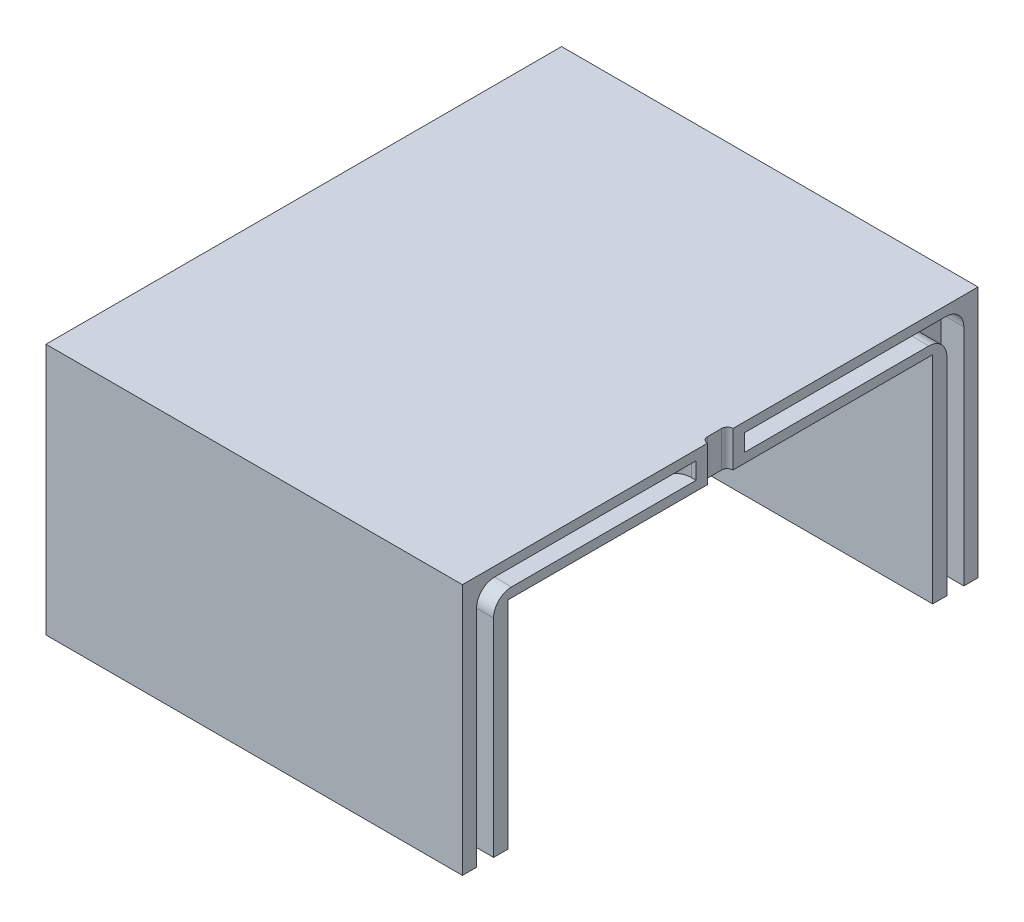
ISO-10303-21;
HEADER;
FILE_DESCRIPTION(('STEP AP214'),'2;1');
FILE_NAME('part.step','',(''),(''),'','','');
FILE_SCHEMA(('AUTOMOTIVE_DESIGN { 1 0 10303 214 1 1 1 1 }'));
ENDSEC;
DATA;
#1=APPLICATION_CONTEXT('core data for automotive mechanical design processes');
#2=APPLICATION_PROTOCOL_DEFINITION('international standard','automotive_design',2000,#1);
#3=PRODUCT_CONTEXT('',#1,'mechanical');
#4=PRODUCT('Part','Part','',(#3));
#5=PRODUCT_RELATED_PRODUCT_CATEGORY('part','',(#4));
#6=PRODUCT_DEFINITION_FORMATION('','',#4);
#7=PRODUCT_DEFINITION_CONTEXT('part definition',#1,'design');
#8=PRODUCT_DEFINITION('design','',#6,#7);
#9=PRODUCT_DEFINITION_SHAPE('','',#8);
#10=(LENGTH_UNIT() NAMED_UNIT(*) SI_UNIT(.MILLI.,.METRE.));
#11=(NAMED_UNIT(*) PLANE_ANGLE_UNIT() SI_UNIT($,.RADIAN.));
#12=(NAMED_UNIT(*) SI_UNIT($,.STERADIAN.) SOLID_ANGLE_UNIT());
#13=UNCERTAINTY_MEASURE_WITH_UNIT(LENGTH_MEASURE(1.E-05),#10,'distance_accuracy_value','');
#14=(GEOMETRIC_REPRESENTATION_CONTEXT(3) GLOBAL_UNCERTAINTY_ASSIGNED_CONTEXT((#13)) GLOBAL_UNIT_ASSIGNED_CONTEXT((#10,
#11,#12)) REPRESENTATION_CONTEXT('',''));
#15=CARTESIAN_POINT('',(0.,0.,0.));
#16=DIRECTION('',(0.,0.,1.));
#17=DIRECTION('',(1.,0.,0.));
#18=AXIS2_PLACEMENT_3D('',#15,#16,#17);
#19=CARTESIAN_POINT('',(0.,19.05,0.));
#20=DIRECTION('',(1.,0.,0.));
#21=DIRECTION('',(0.,0.,-1.));
#22=AXIS2_PLACEMENT_3D('',#19,#20,#21);
#23=PLANE('',#22);
#24=DIRECTION('',(0.,-1.,0.));
#25=VECTOR('',#24,1.);
#26=CARTESIAN_POINT('',(0.,0.,2.75));
#27=LINE('',#26,#25);
#28=CARTESIAN_POINT('',(0.,18.3,2.75));
#29=VERTEX_POINT('',#28);
#30=CARTESIAN_POINT('',(0.,0.,2.75));
#31=VERTEX_POINT('',#30);
#32=EDGE_CURVE('E305',#29,#31,#27,.T.);
#33=ORIENTED_EDGE('',*,*,#32,.F.);
#34=CARTESIAN_POINT('',(0.,18.3,4.3375));
#35=DIRECTION('',(1.,0.,0.));
#36=DIRECTION('',(0.,0.,-1.));
#37=AXIS2_PLACEMENT_3D('',#34,#35,#36);
#38=CIRCLE('',#37,1.5875);
#39=CARTESIAN_POINT('',(0.,19.8875,4.3375));
#40=VERTEX_POINT('',#39);
#41=EDGE_CURVE('E445',#29,#40,#38,.T.);
#42=ORIENTED_EDGE('',*,*,#41,.T.);
#43=DIRECTION('',(0.,0.,-1.));
#44=VECTOR('',#43,1.);
#45=CARTESIAN_POINT('',(0.,19.8875,0.));
#46=LINE('',#45,#44);
#47=CARTESIAN_POINT('',(0.,19.8875,20.625));
#48=VERTEX_POINT('',#47);
#49=EDGE_CURVE('E302',#48,#40,#46,.T.);
#50=ORIENTED_EDGE('',*,*,#49,.F.);
#51=DIRECTION('',(0.,-1.,0.));
#52=VECTOR('',#51,1.);
#53=CARTESIAN_POINT('',(0.,0.,20.625));
#54=LINE('',#53,#52);
#55=CARTESIAN_POINT('',(0.,21.3875,20.625));
#56=VERTEX_POINT('',#55);
#57=EDGE_CURVE('E299',#56,#48,#54,.T.);
#58=ORIENTED_EDGE('',*,*,#57,.F.);
#59=DIRECTION('',(0.,0.,-1.));
#60=VECTOR('',#59,1.);
#61=CARTESIAN_POINT('',(0.,21.3875,0.));
#62=LINE('',#61,#60);
#63=CARTESIAN_POINT('',(0.,21.3875,2.8375));
#64=VERTEX_POINT('',#63);
#65=EDGE_CURVE('E296',#56,#64,#62,.T.);
#66=ORIENTED_EDGE('',*,*,#65,.T.);
#67=CARTESIAN_POINT('',(0.,19.8,2.8375));
#68=DIRECTION('',(1.,0.,0.));
#69=DIRECTION('',(0.,0.,-1.));
#70=AXIS2_PLACEMENT_3D('',#67,#68,#69);
#71=CIRCLE('',#70,1.5875);
#72=CARTESIAN_POINT('',(0.,19.8,1.25));
#73=VERTEX_POINT('',#72);
#74=EDGE_CURVE('E11',#64,#73,#71,.F.);
#75=ORIENTED_EDGE('',*,*,#74,.T.);
#76=DIRECTION('',(0.,-1.,0.));
#77=VECTOR('',#76,1.);
#78=CARTESIAN_POINT('',(0.,0.,1.25));
#79=LINE('',#78,#77);
#80=CARTESIAN_POINT('',(0.,0.,1.25));
#81=VERTEX_POINT('',#80);
#82=EDGE_CURVE('E285',#73,#81,#79,.T.);
#83=ORIENTED_EDGE('',*,*,#82,.T.);
#84=DIRECTION('',(0.,0.,1.));
#85=VECTOR('',#84,1.);
#86=CARTESIAN_POINT('',(0.,0.,0.));
#87=LINE('',#86,#85);
#88=CARTESIAN_POINT('',(0.,0.,0.));
#89=VERTEX_POINT('',#88);
#90=EDGE_CURVE('E393',#89,#81,#87,.T.);
#91=ORIENTED_EDGE('',*,*,#90,.F.);
#92=DIRECTION('',(0.,-1.,0.));
#93=VECTOR('',#92,1.);
#94=CARTESIAN_POINT('',(0.,19.05,0.));
#95=LINE('',#94,#93);
#96=CARTESIAN_POINT('',(0.,22.225,0.));
#97=VERTEX_POINT('',#96);
#98=EDGE_CURVE('E414',#97,#89,#95,.T.);
#99=ORIENTED_EDGE('',*,*,#98,.F.);
#100=DIRECTION('',(0.,0.,-1.));
#101=VECTOR('',#100,1.);
#102=CARTESIAN_POINT('',(0.,22.225,0.));
#103=LINE('',#102,#101);
#104=CARTESIAN_POINT('',(0.,22.225,21.625));
#105=VERTEX_POINT('',#104);
#106=EDGE_CURVE('E330',#105,#97,#103,.T.);
#107=ORIENTED_EDGE('',*,*,#106,.F.);
#108=DIRECTION('',(0.,-1.,0.));
#109=VECTOR('',#108,1.);
#110=CARTESIAN_POINT('',(0.,22.225,21.625));
#111=LINE('',#110,#109);
#112=CARTESIAN_POINT('',(0.,19.05,21.625));
#113=VERTEX_POINT('',#112);
#114=EDGE_CURVE('E353',#105,#113,#111,.T.);
#115=ORIENTED_EDGE('',*,*,#114,.T.);
#116=DIRECTION('',(0.,0.,-1.));
#117=VECTOR('',#116,1.);
#118=CARTESIAN_POINT('',(0.,19.05,0.));
#119=LINE('',#118,#117);
#120=CARTESIAN_POINT('',(0.,19.05,4.));
#121=VERTEX_POINT('',#120);
#122=EDGE_CURVE('E329',#113,#121,#119,.T.);
#123=ORIENTED_EDGE('',*,*,#122,.T.);
#124=DIRECTION('',(0.,-1.,0.));
#125=VECTOR('',#124,1.);
#126=CARTESIAN_POINT('',(0.,19.05,4.));
#127=LINE('',#126,#125);
#128=CARTESIAN_POINT('',(0.,0.,4.));
#129=VERTEX_POINT('',#128);
#130=EDGE_CURVE('E416',#121,#129,#127,.T.);
#131=ORIENTED_EDGE('',*,*,#130,.T.);
#132=EDGE_CURVE('E392',#31,#129,#87,.T.);
#133=ORIENTED_EDGE('',*,*,#132,.F.);
#134=EDGE_LOOP('',(#33,#42,#50,#58,#66,#75,#83,#91,#99,#107,#115,#123,#131,#133));
#135=FACE_BOUND('',#134,.T.);
#136=ADVANCED_FACE('F41',(#135),#23,.T.);
#137=CARTESIAN_POINT('',(0.,0.,0.));
#138=DIRECTION('',(0.,1.,0.));
#139=DIRECTION('',(0.,0.,1.));
#140=AXIS2_PLACEMENT_3D('',#137,#138,#139);
#141=PLANE('',#140);
#142=CARTESIAN_POINT('',(-18.375,0.,43.));
#143=DIRECTION('',(0.,-1.,0.));
#144=DIRECTION('',(0.,0.,-1.));
#145=AXIS2_PLACEMENT_3D('',#142,#143,#144);
#146=CIRCLE('',#145,0.88899999999999);
#147=CARTESIAN_POINT('',(-18.375,0.,42.111));
#148=VERTEX_POINT('',#147);
#149=EDGE_CURVE('E323',#148,#148,#146,.T.);
#150=ORIENTED_EDGE('',*,*,#149,.F.);
#151=EDGE_LOOP('',(#150));
#152=FACE_BOUND('',#151,.T.);
#153=CARTESIAN_POINT('',(-18.375,0.,2.5));
#154=DIRECTION('',(0.,-1.,0.));
#155=DIRECTION('',(0.,0.,-1.));
#156=AXIS2_PLACEMENT_3D('',#153,#154,#155);
#157=CIRCLE('',#156,0.88899999999999);
#158=CARTESIAN_POINT('',(-18.375,0.,1.61100000000001));
#159=VERTEX_POINT('',#158);
#160=EDGE_CURVE('E275',#159,#159,#157,.T.);
#161=ORIENTED_EDGE('',*,*,#160,.F.);
#162=EDGE_LOOP('',(#161));
#163=FACE_BOUND('',#162,.T.);
#164=CARTESIAN_POINT('',(0.,0.,41.5));
#165=VERTEX_POINT('',#164);
#166=CARTESIAN_POINT('',(0.,0.,42.75));
#167=VERTEX_POINT('',#166);
#168=EDGE_CURVE('E271',#165,#167,#87,.T.);
#169=ORIENTED_EDGE('',*,*,#168,.T.);
#170=DIRECTION('',(1.,0.,0.));
#171=VECTOR('',#170,1.);
#172=CARTESIAN_POINT('',(-2.,0.,42.75));
#173=LINE('',#172,#171);
#174=CARTESIAN_POINT('',(-2.,0.,42.75));
#175=VERTEX_POINT('',#174);
#176=EDGE_CURVE('E249',#175,#167,#173,.T.);
#177=ORIENTED_EDGE('',*,*,#176,.F.);
#178=DIRECTION('',(0.,0.,-1.));
#179=VECTOR('',#178,1.);
#180=CARTESIAN_POINT('',(-2.,0.,0.));
#181=LINE('',#180,#179);
#182=CARTESIAN_POINT('',(-2.,0.,44.25));
#183=VERTEX_POINT('',#182);
#184=EDGE_CURVE('E256',#183,#175,#181,.T.);
#185=ORIENTED_EDGE('',*,*,#184,.F.);
#186=DIRECTION('',(1.,0.,0.));
#187=VECTOR('',#186,1.);
#188=CARTESIAN_POINT('',(-2.,0.,44.25));
#189=LINE('',#188,#187);
#190=CARTESIAN_POINT('',(0.,0.,44.25));
#191=VERTEX_POINT('',#190);
#192=EDGE_CURVE('E273',#183,#191,#189,.T.);
#193=ORIENTED_EDGE('',*,*,#192,.T.);
#194=CARTESIAN_POINT('',(0.,0.,45.5));
#195=VERTEX_POINT('',#194);
#196=EDGE_CURVE('E404',#191,#195,#87,.T.);
#197=ORIENTED_EDGE('',*,*,#196,.T.);
#198=DIRECTION('',(-1.,0.,0.));
#199=VECTOR('',#198,1.);
#200=CARTESIAN_POINT('',(0.,0.,45.5));
#201=LINE('',#200,#199);
#202=CARTESIAN_POINT('',(-36.75,0.,45.5));
#203=VERTEX_POINT('',#202);
#204=EDGE_CURVE('E401',#195,#203,#201,.T.);
#205=ORIENTED_EDGE('',*,*,#204,.T.);
#206=DIRECTION('',(0.,0.,1.));
#207=VECTOR('',#206,1.);
#208=CARTESIAN_POINT('',(-36.75,0.,0.));
#209=LINE('',#208,#207);
#210=CARTESIAN_POINT('',(-36.75,0.,0.));
#211=VERTEX_POINT('',#210);
#212=EDGE_CURVE('E398',#211,#203,#209,.T.);
#213=ORIENTED_EDGE('',*,*,#212,.F.);
#214=DIRECTION('',(-1.,0.,0.));
#215=VECTOR('',#214,1.);
#216=CARTESIAN_POINT('',(0.,0.,0.));
#217=LINE('',#216,#215);
#218=EDGE_CURVE('E396',#89,#211,#217,.T.);
#219=ORIENTED_EDGE('',*,*,#218,.F.);
#220=ORIENTED_EDGE('',*,*,#90,.T.);
#221=DIRECTION('',(1.,0.,0.));
#222=VECTOR('',#221,1.);
#223=CARTESIAN_POINT('',(-2.,0.,1.25));
#224=LINE('',#223,#222);
#225=CARTESIAN_POINT('',(-2.,0.,1.25));
#226=VERTEX_POINT('',#225);
#227=EDGE_CURVE('E308',#226,#81,#224,.T.);
#228=ORIENTED_EDGE('',*,*,#227,.F.);
#229=DIRECTION('',(0.,0.,-1.));
#230=VECTOR('',#229,1.);
#231=CARTESIAN_POINT('',(-2.,0.,0.));
#232=LINE('',#231,#230);
#233=CARTESIAN_POINT('',(-2.,0.,2.75));
#234=VERTEX_POINT('',#233);
#235=EDGE_CURVE('E290',#234,#226,#232,.T.);
#236=ORIENTED_EDGE('',*,*,#235,.F.);
#237=DIRECTION('',(1.,0.,0.));
#238=VECTOR('',#237,1.);
#239=CARTESIAN_POINT('',(-2.,0.,2.75));
#240=LINE('',#239,#238);
#241=EDGE_CURVE('E312',#234,#31,#240,.T.);
#242=ORIENTED_EDGE('',*,*,#241,.T.);
#243=ORIENTED_EDGE('',*,*,#132,.T.);
#244=DIRECTION('',(-1.,0.,0.));
#245=VECTOR('',#244,1.);
#246=CARTESIAN_POINT('',(0.,0.,4.));
#247=LINE('',#246,#245);
#248=CARTESIAN_POINT('',(-32.75,0.,4.));
#249=VERTEX_POINT('',#248);
#250=EDGE_CURVE('E389',#129,#249,#247,.T.);
#251=ORIENTED_EDGE('',*,*,#250,.T.);
#252=DIRECTION('',(0.,0.,1.));
#253=VECTOR('',#252,1.);
#254=CARTESIAN_POINT('',(-32.75,0.,0.));
#255=LINE('',#254,#253);
#256=CARTESIAN_POINT('',(-32.75,0.,41.5));
#257=VERTEX_POINT('',#256);
#258=EDGE_CURVE('E386',#249,#257,#255,.T.);
#259=ORIENTED_EDGE('',*,*,#258,.T.);
#260=DIRECTION('',(1.,0.,0.));
#261=VECTOR('',#260,1.);
#262=CARTESIAN_POINT('',(0.,0.,41.5));
#263=LINE('',#262,#261);
#264=EDGE_CURVE('E374',#257,#165,#263,.T.);
#265=ORIENTED_EDGE('',*,*,#264,.T.);
#266=EDGE_LOOP('',(#169,#177,#185,#193,#197,#205,#213,#219,#220,#228,#236,#242,#243,#251,#259,#265));
#267=FACE_BOUND('',#266,.T.);
#268=ADVANCED_FACE('F268',(#152,#163,#267),#141,.F.);
#269=CARTESIAN_POINT('',(0.,19.05,41.5));
#270=DIRECTION('',(0.,0.,-1.));
#271=DIRECTION('',(-1.,0.,0.));
#272=AXIS2_PLACEMENT_3D('',#269,#270,#271);
#273=PLANE('',#272);
#274=ORIENTED_EDGE('',*,*,#264,.F.);
#275=DIRECTION('',(0.,-1.,0.));
#276=VECTOR('',#275,1.);
#277=CARTESIAN_POINT('',(-32.75,19.05,41.5));
#278=LINE('',#277,#276);
#279=CARTESIAN_POINT('',(-32.75,19.05,41.5));
#280=VERTEX_POINT('',#279);
#281=EDGE_CURVE('E421',#280,#257,#278,.T.);
#282=ORIENTED_EDGE('',*,*,#281,.F.);
#283=DIRECTION('',(1.,0.,0.));
#284=VECTOR('',#283,1.);
#285=CARTESIAN_POINT('',(0.,19.05,41.5));
#286=LINE('',#285,#284);
#287=CARTESIAN_POINT('',(0.,19.05,41.5));
#288=VERTEX_POINT('',#287);
#289=EDGE_CURVE('E375',#280,#288,#286,.T.);
#290=ORIENTED_EDGE('',*,*,#289,.T.);
#291=DIRECTION('',(0.,-1.,0.));
#292=VECTOR('',#291,1.);
#293=CARTESIAN_POINT('',(0.,19.05,41.5));
#294=LINE('',#293,#292);
#295=EDGE_CURVE('E384',#288,#165,#294,.T.);
#296=ORIENTED_EDGE('',*,*,#295,.T.);
#297=EDGE_LOOP('',(#274,#282,#290,#296));
#298=FACE_BOUND('',#297,.T.);
#299=ADVANCED_FACE('F516',(#298),#273,.T.);
#300=CARTESIAN_POINT('',(-32.75,19.05,0.));
#301=DIRECTION('',(1.,0.,0.));
#302=DIRECTION('',(0.,0.,-1.));
#303=AXIS2_PLACEMENT_3D('',#300,#301,#302);
#304=PLANE('',#303);
#305=ORIENTED_EDGE('',*,*,#258,.F.);
#306=DIRECTION('',(0.,-1.,0.));
#307=VECTOR('',#306,1.);
#308=CARTESIAN_POINT('',(-32.75,19.05,4.));
#309=LINE('',#308,#307);
#310=CARTESIAN_POINT('',(-32.75,19.05,4.));
#311=VERTEX_POINT('',#310);
#312=EDGE_CURVE('E419',#311,#249,#309,.T.);
#313=ORIENTED_EDGE('',*,*,#312,.F.);
#314=DIRECTION('',(0.,0.,1.));
#315=VECTOR('',#314,1.);
#316=CARTESIAN_POINT('',(-32.75,19.05,0.));
#317=LINE('',#316,#315);
#318=EDGE_CURVE('E378',#311,#280,#317,.T.);
#319=ORIENTED_EDGE('',*,*,#318,.T.);
#320=ORIENTED_EDGE('',*,*,#281,.T.);
#321=EDGE_LOOP('',(#305,#313,#319,#320));
#322=FACE_BOUND('',#321,.T.);
#323=ADVANCED_FACE('F585',(#322),#304,.T.);
#324=CARTESIAN_POINT('',(0.,19.05,4.));
#325=DIRECTION('',(0.,0.,1.));
#326=DIRECTION('',(1.,0.,0.));
#327=AXIS2_PLACEMENT_3D('',#324,#325,#326);
#328=PLANE('',#327);
#329=ORIENTED_EDGE('',*,*,#250,.F.);
#330=ORIENTED_EDGE('',*,*,#130,.F.);
#331=DIRECTION('',(-1.,0.,0.));
#332=VECTOR('',#331,1.);
#333=CARTESIAN_POINT('',(0.,19.05,4.));
#334=LINE('',#333,#332);
#335=EDGE_CURVE('E381',#121,#311,#334,.T.);
#336=ORIENTED_EDGE('',*,*,#335,.T.);
#337=ORIENTED_EDGE('',*,*,#312,.T.);
#338=EDGE_LOOP('',(#329,#330,#336,#337));
#339=FACE_BOUND('',#338,.T.);
#340=ADVANCED_FACE('F589',(#339),#328,.T.);
#341=CARTESIAN_POINT('',(0.,19.05,0.));
#342=DIRECTION('',(0.,0.,1.));
#343=DIRECTION('',(1.,0.,0.));
#344=AXIS2_PLACEMENT_3D('',#341,#342,#343);
#345=PLANE('',#344);
#346=ORIENTED_EDGE('',*,*,#218,.T.);
#347=DIRECTION('',(0.,-1.,0.));
#348=VECTOR('',#347,1.);
#349=CARTESIAN_POINT('',(-36.75,19.05,0.));
#350=LINE('',#349,#348);
#351=CARTESIAN_POINT('',(-36.75,22.225,0.));
#352=VERTEX_POINT('',#351);
#353=EDGE_CURVE('E411',#352,#211,#350,.T.);
#354=ORIENTED_EDGE('',*,*,#353,.F.);
#355=DIRECTION('',(1.,0.,0.));
#356=VECTOR('',#355,1.);
#357=CARTESIAN_POINT('',(0.,22.225,0.));
#358=LINE('',#357,#356);
#359=EDGE_CURVE('E333',#352,#97,#358,.T.);
#360=ORIENTED_EDGE('',*,*,#359,.T.);
#361=ORIENTED_EDGE('',*,*,#98,.T.);
#362=EDGE_LOOP('',(#346,#354,#360,#361));
#363=FACE_BOUND('',#362,.T.);
#364=ADVANCED_FACE('F593',(#363),#345,.F.);
#365=CARTESIAN_POINT('',(-36.75,19.05,0.));
#366=DIRECTION('',(1.,0.,0.));
#367=DIRECTION('',(0.,0.,-1.));
#368=AXIS2_PLACEMENT_3D('',#365,#366,#367);
#369=PLANE('',#368);
#370=ORIENTED_EDGE('',*,*,#212,.T.);
#371=DIRECTION('',(0.,-1.,0.));
#372=VECTOR('',#371,1.);
#373=CARTESIAN_POINT('',(-36.75,19.05,45.5));
#374=LINE('',#373,#372);
#375=CARTESIAN_POINT('',(-36.75,22.225,45.5));
#376=VERTEX_POINT('',#375);
#377=EDGE_CURVE('E409',#376,#203,#374,.T.);
#378=ORIENTED_EDGE('',*,*,#377,.F.);
#379=DIRECTION('',(0.,0.,-1.));
#380=VECTOR('',#379,1.);
#381=CARTESIAN_POINT('',(-36.75,22.225,0.));
#382=LINE('',#381,#380);
#383=EDGE_CURVE('E337',#376,#352,#382,.T.);
#384=ORIENTED_EDGE('',*,*,#383,.T.);
#385=ORIENTED_EDGE('',*,*,#353,.T.);
#386=EDGE_LOOP('',(#370,#378,#384,#385));
#387=FACE_BOUND('',#386,.T.);
#388=ADVANCED_FACE('F531',(#387),#369,.F.);
#389=CARTESIAN_POINT('',(0.,19.05,45.5));
#390=DIRECTION('',(0.,0.,1.));
#391=DIRECTION('',(1.,0.,0.));
#392=AXIS2_PLACEMENT_3D('',#389,#390,#391);
#393=PLANE('',#392);
#394=ORIENTED_EDGE('',*,*,#204,.F.);
#395=DIRECTION('',(0.,-1.,0.));
#396=VECTOR('',#395,1.);
#397=CARTESIAN_POINT('',(0.,19.05,45.5));
#398=LINE('',#397,#396);
#399=CARTESIAN_POINT('',(0.,22.225,45.5));
#400=VERTEX_POINT('',#399);
#401=EDGE_CURVE('E406',#400,#195,#398,.T.);
#402=ORIENTED_EDGE('',*,*,#401,.F.);
#403=DIRECTION('',(1.,0.,0.));
#404=VECTOR('',#403,1.);
#405=CARTESIAN_POINT('',(0.,22.225,45.5));
#406=LINE('',#405,#404);
#407=EDGE_CURVE('E340',#376,#400,#406,.T.);
#408=ORIENTED_EDGE('',*,*,#407,.F.);
#409=ORIENTED_EDGE('',*,*,#377,.T.);
#410=EDGE_LOOP('',(#394,#402,#408,#409));
#411=FACE_BOUND('',#410,.T.);
#412=ADVANCED_FACE('F522',(#411),#393,.T.);
#413=DIRECTION('',(0.,0.,-1.));
#414=VECTOR('',#413,1.);
#415=CARTESIAN_POINT('',(0.,19.8875,0.));
#416=LINE('',#415,#414);
#417=CARTESIAN_POINT('',(0.,19.8875,41.1625));
#418=VERTEX_POINT('',#417);
#419=CARTESIAN_POINT('',(0.,19.8875,24.875));
#420=VERTEX_POINT('',#419);
#421=EDGE_CURVE('E536',#418,#420,#416,.T.);
#422=ORIENTED_EDGE('',*,*,#421,.F.);
#423=CARTESIAN_POINT('',(0.,18.3,41.1625));
#424=DIRECTION('',(1.,0.,0.));
#425=DIRECTION('',(0.,0.,-1.));
#426=AXIS2_PLACEMENT_3D('',#423,#424,#425);
#427=CIRCLE('',#426,1.5875);
#428=CARTESIAN_POINT('',(0.,18.3,42.75));
#429=VERTEX_POINT('',#428);
#430=EDGE_CURVE('E439',#418,#429,#427,.T.);
#431=ORIENTED_EDGE('',*,*,#430,.T.);
#432=DIRECTION('',(0.,1.,0.));
#433=VECTOR('',#432,1.);
#434=CARTESIAN_POINT('',(0.,0.,42.75));
#435=LINE('',#434,#433);
#436=EDGE_CURVE('E542',#167,#429,#435,.T.);
#437=ORIENTED_EDGE('',*,*,#436,.F.);
#438=ORIENTED_EDGE('',*,*,#168,.F.);
#439=ORIENTED_EDGE('',*,*,#295,.F.);
#440=DIRECTION('',(0.,0.,-1.));
#441=VECTOR('',#440,1.);
#442=CARTESIAN_POINT('',(0.,19.05,0.));
#443=LINE('',#442,#441);
#444=CARTESIAN_POINT('',(0.,19.05,23.875));
#445=VERTEX_POINT('',#444);
#446=EDGE_CURVE('E356',#288,#445,#443,.T.);
#447=ORIENTED_EDGE('',*,*,#446,.T.);
#448=DIRECTION('',(0.,-1.,0.));
#449=VECTOR('',#448,1.);
#450=CARTESIAN_POINT('',(0.,22.225,23.875));
#451=LINE('',#450,#449);
#452=CARTESIAN_POINT('',(0.,22.225,23.875));
#453=VERTEX_POINT('',#452);
#454=EDGE_CURVE('E371',#453,#445,#451,.T.);
#455=ORIENTED_EDGE('',*,*,#454,.F.);
#456=DIRECTION('',(0.,0.,-1.));
#457=VECTOR('',#456,1.);
#458=CARTESIAN_POINT('',(0.,22.225,0.));
#459=LINE('',#458,#457);
#460=EDGE_CURVE('E343',#400,#453,#459,.T.);
#461=ORIENTED_EDGE('',*,*,#460,.F.);
#462=ORIENTED_EDGE('',*,*,#401,.T.);
#463=ORIENTED_EDGE('',*,*,#196,.F.);
#464=DIRECTION('',(0.,1.,0.));
#465=VECTOR('',#464,1.);
#466=CARTESIAN_POINT('',(0.,0.,44.25));
#467=LINE('',#466,#465);
#468=CARTESIAN_POINT('',(0.,19.8,44.25));
#469=VERTEX_POINT('',#468);
#470=EDGE_CURVE('E545',#191,#469,#467,.T.);
#471=ORIENTED_EDGE('',*,*,#470,.T.);
#472=CARTESIAN_POINT('',(0.,19.8,42.6625));
#473=DIRECTION('',(1.,0.,0.));
#474=DIRECTION('',(0.,0.,-1.));
#475=AXIS2_PLACEMENT_3D('',#472,#473,#474);
#476=CIRCLE('',#475,1.5875);
#477=CARTESIAN_POINT('',(0.,21.3875,42.6625));
#478=VERTEX_POINT('',#477);
#479=EDGE_CURVE('E466',#469,#478,#476,.F.);
#480=ORIENTED_EDGE('',*,*,#479,.T.);
#481=DIRECTION('',(0.,0.,-1.));
#482=VECTOR('',#481,1.);
#483=CARTESIAN_POINT('',(0.,21.3875,0.));
#484=LINE('',#483,#482);
#485=CARTESIAN_POINT('',(0.,21.3875,24.875));
#486=VERTEX_POINT('',#485);
#487=EDGE_CURVE('E550',#478,#486,#484,.T.);
#488=ORIENTED_EDGE('',*,*,#487,.T.);
#489=DIRECTION('',(0.,-1.,0.));
#490=VECTOR('',#489,1.);
#491=CARTESIAN_POINT('',(0.,0.,24.875));
#492=LINE('',#491,#490);
#493=EDGE_CURVE('E311',#486,#420,#492,.T.);
#494=ORIENTED_EDGE('',*,*,#493,.T.);
#495=EDGE_LOOP('',(#422,#431,#437,#438,#439,#447,#455,#461,#462,#463,#471,#480,#488,#494));
#496=FACE_BOUND('',#495,.T.);
#497=ADVANCED_FACE('F512',(#496),#23,.T.);
#498=CARTESIAN_POINT('',(0.,22.225,23.375));
#499=DIRECTION('',(0.,-1.,0.));
#500=DIRECTION('',(0.,0.,-1.));
#501=AXIS2_PLACEMENT_3D('',#498,#499,#500);
#502=CYLINDRICAL_SURFACE('',#501,0.499999999999994);
#503=CARTESIAN_POINT('',(0.,19.05,23.375));
#504=DIRECTION('',(0.,1.,0.));
#505=DIRECTION('',(0.,0.,1.));
#506=AXIS2_PLACEMENT_3D('',#503,#504,#505);
#507=CIRCLE('',#506,0.499999999999994);
#508=CARTESIAN_POINT('',(-0.499999999999991,19.05,23.375));
#509=VERTEX_POINT('',#508);
#510=EDGE_CURVE('E358',#509,#445,#507,.T.);
#511=ORIENTED_EDGE('',*,*,#510,.F.);
#512=DIRECTION('',(0.,-1.,0.));
#513=VECTOR('',#512,1.);
#514=CARTESIAN_POINT('',(-0.499999999999991,22.225,23.375));
#515=LINE('',#514,#513);
#516=CARTESIAN_POINT('',(-0.499999999999991,22.225,23.375));
#517=VERTEX_POINT('',#516);
#518=EDGE_CURVE('E369',#517,#509,#515,.T.);
#519=ORIENTED_EDGE('',*,*,#518,.F.);
#520=CARTESIAN_POINT('',(0.,22.225,23.375));
#521=DIRECTION('',(0.,1.,0.));
#522=DIRECTION('',(0.,0.,1.));
#523=AXIS2_PLACEMENT_3D('',#520,#521,#522);
#524=CIRCLE('',#523,0.499999999999994);
#525=EDGE_CURVE('E345',#517,#453,#524,.T.);
#526=ORIENTED_EDGE('',*,*,#525,.T.);
#527=ORIENTED_EDGE('',*,*,#454,.T.);
#528=EDGE_LOOP('',(#511,#519,#526,#527));
#529=FACE_BOUND('',#528,.T.);
#530=ADVANCED_FACE('F521',(#529),#502,.F.);
#531=CARTESIAN_POINT('',(-0.499999999999993,22.225,0.));
#532=DIRECTION('',(-1.,0.,0.));
#533=DIRECTION('',(0.,0.,1.));
#534=AXIS2_PLACEMENT_3D('',#531,#532,#533);
#535=PLANE('',#534);
#536=DIRECTION('',(0.,0.,-1.));
#537=VECTOR('',#536,1.);
#538=CARTESIAN_POINT('',(-0.499999999999993,19.05,0.));
#539=LINE('',#538,#537);
#540=CARTESIAN_POINT('',(-0.499999999999997,19.05,22.125));
#541=VERTEX_POINT('',#540);
#542=EDGE_CURVE('E361',#509,#541,#539,.T.);
#543=ORIENTED_EDGE('',*,*,#542,.T.);
#544=DIRECTION('',(0.,-1.,0.));
#545=VECTOR('',#544,1.);
#546=CARTESIAN_POINT('',(-0.499999999999997,22.225,22.125));
#547=LINE('',#546,#545);
#548=CARTESIAN_POINT('',(-0.499999999999997,22.225,22.125));
#549=VERTEX_POINT('',#548);
#550=EDGE_CURVE('E367',#549,#541,#547,.T.);
#551=ORIENTED_EDGE('',*,*,#550,.F.);
#552=DIRECTION('',(0.,0.,-1.));
#553=VECTOR('',#552,1.);
#554=CARTESIAN_POINT('',(-0.499999999999993,22.225,0.));
#555=LINE('',#554,#553);
#556=EDGE_CURVE('E348',#517,#549,#555,.T.);
#557=ORIENTED_EDGE('',*,*,#556,.F.);
#558=ORIENTED_EDGE('',*,*,#518,.T.);
#559=EDGE_LOOP('',(#543,#551,#557,#558));
#560=FACE_BOUND('',#559,.T.);
#561=ADVANCED_FACE('F528',(#560),#535,.F.);
#562=CARTESIAN_POINT('',(0.,22.225,22.125));
#563=DIRECTION('',(0.,-1.,0.));
#564=DIRECTION('',(0.,0.,-1.));
#565=AXIS2_PLACEMENT_3D('',#562,#563,#564);
#566=CYLINDRICAL_SURFACE('',#565,0.499999999999994);
#567=CARTESIAN_POINT('',(0.,19.05,22.125));
#568=DIRECTION('',(0.,1.,0.));
#569=DIRECTION('',(0.,0.,1.));
#570=AXIS2_PLACEMENT_3D('',#567,#568,#569);
#571=CIRCLE('',#570,0.499999999999994);
#572=EDGE_CURVE('E334',#113,#541,#571,.T.);
#573=ORIENTED_EDGE('',*,*,#572,.F.);
#574=ORIENTED_EDGE('',*,*,#114,.F.);
#575=CARTESIAN_POINT('',(0.,22.225,22.125));
#576=DIRECTION('',(0.,1.,0.));
#577=DIRECTION('',(0.,0.,1.));
#578=AXIS2_PLACEMENT_3D('',#575,#576,#577);
#579=CIRCLE('',#578,0.499999999999994);
#580=EDGE_CURVE('E350',#105,#549,#579,.T.);
#581=ORIENTED_EDGE('',*,*,#580,.T.);
#582=ORIENTED_EDGE('',*,*,#550,.T.);
#583=EDGE_LOOP('',(#573,#574,#581,#582));
#584=FACE_BOUND('',#583,.T.);
#585=ADVANCED_FACE('F635',(#584),#566,.F.);
#586=CARTESIAN_POINT('',(0.,22.225,23.375));
#587=DIRECTION('',(0.,1.,0.));
#588=DIRECTION('',(0.,0.,1.));
#589=AXIS2_PLACEMENT_3D('',#586,#587,#588);
#590=PLANE('',#589);
#591=ORIENTED_EDGE('',*,*,#106,.T.);
#592=ORIENTED_EDGE('',*,*,#359,.F.);
#593=ORIENTED_EDGE('',*,*,#383,.F.);
#594=ORIENTED_EDGE('',*,*,#407,.T.);
#595=ORIENTED_EDGE('',*,*,#460,.T.);
#596=ORIENTED_EDGE('',*,*,#525,.F.);
#597=ORIENTED_EDGE('',*,*,#556,.T.);
#598=ORIENTED_EDGE('',*,*,#580,.F.);
#599=EDGE_LOOP('',(#591,#592,#593,#594,#595,#596,#597,#598));
#600=FACE_BOUND('',#599,.T.);
#601=ADVANCED_FACE('F610',(#600),#590,.T.);
#602=CARTESIAN_POINT('',(0.,19.05,23.375));
#603=DIRECTION('',(0.,1.,0.));
#604=DIRECTION('',(0.,0.,1.));
#605=AXIS2_PLACEMENT_3D('',#602,#603,#604);
#606=PLANE('',#605);
#607=ORIENTED_EDGE('',*,*,#289,.F.);
#608=ORIENTED_EDGE('',*,*,#318,.F.);
#609=ORIENTED_EDGE('',*,*,#335,.F.);
#610=ORIENTED_EDGE('',*,*,#122,.F.);
#611=ORIENTED_EDGE('',*,*,#572,.T.);
#612=ORIENTED_EDGE('',*,*,#542,.F.);
#613=ORIENTED_EDGE('',*,*,#510,.T.);
#614=ORIENTED_EDGE('',*,*,#446,.F.);
#615=EDGE_LOOP('',(#607,#608,#609,#610,#611,#612,#613,#614));
#616=FACE_BOUND('',#615,.T.);
#617=ADVANCED_FACE('F629',(#616),#606,.F.);
#618=CARTESIAN_POINT('',(-18.375,5.73,43.));
#619=DIRECTION('',(0.,-1.,0.));
#620=DIRECTION('',(0.,0.,-1.));
#621=AXIS2_PLACEMENT_3D('',#618,#619,#620);
#622=CONICAL_SURFACE('',#621,0.888999999999997,1.02974425867665);
#623=CARTESIAN_POINT('',(-18.375,6.2641650903155,43.));
#624=VERTEX_POINT('',#623);
#625=VERTEX_LOOP('',#624);
#626=FACE_BOUND('',#625,.T.);
#627=CARTESIAN_POINT('',(-18.375,5.73,43.));
#628=DIRECTION('',(0.,-1.,0.));
#629=DIRECTION('',(0.,0.,-1.));
#630=AXIS2_PLACEMENT_3D('',#627,#628,#629);
#631=CIRCLE('',#630,0.888999999999997);
#632=CARTESIAN_POINT('',(-18.375,5.73,42.111));
#633=VERTEX_POINT('',#632);
#634=EDGE_CURVE('E326',#633,#633,#631,.T.);
#635=ORIENTED_EDGE('',*,*,#634,.T.);
#636=EDGE_LOOP('',(#635));
#637=FACE_BOUND('',#636,.T.);
#638=ADVANCED_FACE('F646',(#626,#637),#622,.F.);
#639=CARTESIAN_POINT('',(-18.375,0.,43.));
#640=DIRECTION('',(0.,-1.,0.));
#641=DIRECTION('',(0.,0.,-1.));
#642=AXIS2_PLACEMENT_3D('',#639,#640,#641);
#643=CYLINDRICAL_SURFACE('',#642,0.888999999999994);
#644=ORIENTED_EDGE('',*,*,#634,.F.);
#645=EDGE_LOOP('',(#644));
#646=FACE_BOUND('',#645,.T.);
#647=ORIENTED_EDGE('',*,*,#149,.T.);
#648=EDGE_LOOP('',(#647));
#649=FACE_BOUND('',#648,.T.);
#650=ADVANCED_FACE('F650',(#646,#649),#643,.F.);
#651=CARTESIAN_POINT('',(-18.375,5.73,2.5));
#652=DIRECTION('',(0.,-1.,0.));
#653=DIRECTION('',(0.,0.,-1.));
#654=AXIS2_PLACEMENT_3D('',#651,#652,#653);
#655=CONICAL_SURFACE('',#654,0.888999999999997,1.02974425867665);
#656=CARTESIAN_POINT('',(-18.375,6.2641650903155,2.5));
#657=VERTEX_POINT('',#656);
#658=VERTEX_LOOP('',#657);
#659=FACE_BOUND('',#658,.T.);
#660=CARTESIAN_POINT('',(-18.375,5.73,2.5));
#661=DIRECTION('',(0.,-1.,0.));
#662=DIRECTION('',(0.,0.,-1.));
#663=AXIS2_PLACEMENT_3D('',#660,#661,#662);
#664=CIRCLE('',#663,0.888999999999997);
#665=CARTESIAN_POINT('',(-18.375,5.73,1.61100000000001));
#666=VERTEX_POINT('',#665);
#667=EDGE_CURVE('E320',#666,#666,#664,.T.);
#668=ORIENTED_EDGE('',*,*,#667,.T.);
#669=EDGE_LOOP('',(#668));
#670=FACE_BOUND('',#669,.T.);
#671=ADVANCED_FACE('F654',(#659,#670),#655,.F.);
#672=CARTESIAN_POINT('',(-18.375,0.,2.5));
#673=DIRECTION('',(0.,-1.,0.));
#674=DIRECTION('',(0.,0.,-1.));
#675=AXIS2_PLACEMENT_3D('',#672,#673,#674);
#676=CYLINDRICAL_SURFACE('',#675,0.888999999999994);
#677=ORIENTED_EDGE('',*,*,#667,.F.);
#678=EDGE_LOOP('',(#677));
#679=FACE_BOUND('',#678,.T.);
#680=ORIENTED_EDGE('',*,*,#160,.T.);
#681=EDGE_LOOP('',(#680));
#682=FACE_BOUND('',#681,.T.);
#683=ADVANCED_FACE('F658',(#679,#682),#676,.F.);
#684=CARTESIAN_POINT('',(-2.,21.3875,0.));
#685=DIRECTION('',(0.,-1.,0.));
#686=DIRECTION('',(0.,0.,-1.));
#687=AXIS2_PLACEMENT_3D('',#684,#685,#686);
#688=PLANE('',#687);
#689=DIRECTION('',(0.,0.,-1.));
#690=VECTOR('',#689,1.);
#691=CARTESIAN_POINT('',(-2.,21.3875,0.));
#692=LINE('',#691,#690);
#693=CARTESIAN_POINT('',(-2.,21.3875,19.0375));
#694=VERTEX_POINT('',#693);
#695=CARTESIAN_POINT('',(-2.,21.3875,2.8375));
#696=VERTEX_POINT('',#695);
#697=EDGE_CURVE('E282',#694,#696,#692,.T.);
#698=ORIENTED_EDGE('',*,*,#697,.T.);
#699=DIRECTION('',(1.,0.,0.));
#700=VECTOR('',#699,1.);
#701=CARTESIAN_POINT('',(0.,21.3875,2.8375));
#702=LINE('',#701,#700);
#703=EDGE_CURVE('E453',#696,#64,#702,.T.);
#704=ORIENTED_EDGE('',*,*,#703,.T.);
#705=ORIENTED_EDGE('',*,*,#65,.F.);
#706=DIRECTION('',(1.,0.,0.));
#707=VECTOR('',#706,1.);
#708=CARTESIAN_POINT('',(-2.,21.3875,20.625));
#709=LINE('',#708,#707);
#710=CARTESIAN_POINT('',(-0.4125,21.3875,20.625));
#711=VERTEX_POINT('',#710);
#712=EDGE_CURVE('E295',#711,#56,#709,.T.);
#713=ORIENTED_EDGE('',*,*,#712,.F.);
#714=CARTESIAN_POINT('',(-0.4125,21.3875,19.0375));
#715=DIRECTION('',(0.,-1.,0.));
#716=DIRECTION('',(0.,0.,-1.));
#717=AXIS2_PLACEMENT_3D('',#714,#715,#716);
#718=CIRCLE('',#717,1.5875);
#719=EDGE_CURVE('E451',#711,#694,#718,.T.);
#720=ORIENTED_EDGE('',*,*,#719,.T.);
#721=EDGE_LOOP('',(#698,#704,#705,#713,#720));
#722=FACE_BOUND('',#721,.T.);
#723=ADVANCED_FACE('F495',(#722),#688,.T.);
#724=CARTESIAN_POINT('',(-2.,0.,1.25));
#725=DIRECTION('',(0.,0.,1.));
#726=DIRECTION('',(0.,-1.,0.));
#727=AXIS2_PLACEMENT_3D('',#724,#725,#726);
#728=PLANE('',#727);
#729=ORIENTED_EDGE('',*,*,#82,.F.);
#730=DIRECTION('',(1.,0.,0.));
#731=VECTOR('',#730,1.);
#732=CARTESIAN_POINT('',(-2.,19.8,1.25));
#733=LINE('',#732,#731);
#734=CARTESIAN_POINT('',(-2.,19.8,1.25));
#735=VERTEX_POINT('',#734);
#736=EDGE_CURVE('E56',#73,#735,#733,.F.);
#737=ORIENTED_EDGE('',*,*,#736,.T.);
#738=DIRECTION('',(0.,-1.,0.));
#739=VECTOR('',#738,1.);
#740=CARTESIAN_POINT('',(-2.,0.,1.25));
#741=LINE('',#740,#739);
#742=EDGE_CURVE('E293',#735,#226,#741,.T.);
#743=ORIENTED_EDGE('',*,*,#742,.T.);
#744=ORIENTED_EDGE('',*,*,#227,.T.);
#745=EDGE_LOOP('',(#729,#737,#743,#744));
#746=FACE_BOUND('',#745,.T.);
#747=ADVANCED_FACE('F615',(#746),#728,.T.);
#748=CARTESIAN_POINT('',(-2.,0.,2.75));
#749=DIRECTION('',(0.,0.,1.));
#750=DIRECTION('',(0.,-1.,0.));
#751=AXIS2_PLACEMENT_3D('',#748,#749,#750);
#752=PLANE('',#751);
#753=DIRECTION('',(0.,-1.,0.));
#754=VECTOR('',#753,1.);
#755=CARTESIAN_POINT('',(-2.,0.,2.75));
#756=LINE('',#755,#754);
#757=CARTESIAN_POINT('',(-2.,18.3,2.75));
#758=VERTEX_POINT('',#757);
#759=EDGE_CURVE('E288',#758,#234,#756,.T.);
#760=ORIENTED_EDGE('',*,*,#759,.F.);
#761=DIRECTION('',(1.,0.,0.));
#762=VECTOR('',#761,1.);
#763=CARTESIAN_POINT('',(-2.,18.3,2.75));
#764=LINE('',#763,#762);
#765=EDGE_CURVE('E442',#758,#29,#764,.T.);
#766=ORIENTED_EDGE('',*,*,#765,.T.);
#767=ORIENTED_EDGE('',*,*,#32,.T.);
#768=ORIENTED_EDGE('',*,*,#241,.F.);
#769=EDGE_LOOP('',(#760,#766,#767,#768));
#770=FACE_BOUND('',#769,.T.);
#771=ADVANCED_FACE('F478',(#770),#752,.F.);
#772=CARTESIAN_POINT('',(-2.,19.8875,0.));
#773=DIRECTION('',(0.,-1.,0.));
#774=DIRECTION('',(0.,0.,-1.));
#775=AXIS2_PLACEMENT_3D('',#772,#773,#774);
#776=PLANE('',#775);
#777=ORIENTED_EDGE('',*,*,#49,.T.);
#778=DIRECTION('',(1.,0.,0.));
#779=VECTOR('',#778,1.);
#780=CARTESIAN_POINT('',(-2.,19.8875,4.3375));
#781=LINE('',#780,#779);
#782=CARTESIAN_POINT('',(-2.,19.8875,4.3375));
#783=VERTEX_POINT('',#782);
#784=EDGE_CURVE('E449',#40,#783,#781,.F.);
#785=ORIENTED_EDGE('',*,*,#784,.T.);
#786=DIRECTION('',(0.,0.,-1.));
#787=VECTOR('',#786,1.);
#788=CARTESIAN_POINT('',(-2.,19.8875,0.));
#789=LINE('',#788,#787);
#790=CARTESIAN_POINT('',(-2.,19.8875,19.0375));
#791=VERTEX_POINT('',#790);
#792=EDGE_CURVE('E284',#791,#783,#789,.T.);
#793=ORIENTED_EDGE('',*,*,#792,.F.);
#794=CARTESIAN_POINT('',(-0.4125,19.8875,19.0375));
#795=DIRECTION('',(0.,-1.,0.));
#796=DIRECTION('',(0.,0.,-1.));
#797=AXIS2_PLACEMENT_3D('',#794,#795,#796);
#798=CIRCLE('',#797,1.5875);
#799=CARTESIAN_POINT('',(-0.4125,19.8875,20.625));
#800=VERTEX_POINT('',#799);
#801=EDGE_CURVE('E447',#791,#800,#798,.F.);
#802=ORIENTED_EDGE('',*,*,#801,.T.);
#803=DIRECTION('',(1.,0.,0.));
#804=VECTOR('',#803,1.);
#805=CARTESIAN_POINT('',(-2.,19.8875,20.625));
#806=LINE('',#805,#804);
#807=EDGE_CURVE('E315',#800,#48,#806,.T.);
#808=ORIENTED_EDGE('',*,*,#807,.T.);
#809=EDGE_LOOP('',(#777,#785,#793,#802,#808));
#810=FACE_BOUND('',#809,.T.);
#811=ADVANCED_FACE('F487',(#810),#776,.F.);
#812=CARTESIAN_POINT('',(-2.,0.,20.625));
#813=DIRECTION('',(0.,0.,1.));
#814=DIRECTION('',(1.,0.,0.));
#815=AXIS2_PLACEMENT_3D('',#812,#813,#814);
#816=PLANE('',#815);
#817=ORIENTED_EDGE('',*,*,#807,.F.);
#818=DIRECTION('',(0.,-1.,0.));
#819=VECTOR('',#818,1.);
#820=CARTESIAN_POINT('',(-0.4125,0.,20.625));
#821=LINE('',#820,#819);
#822=EDGE_CURVE('E464',#800,#711,#821,.F.);
#823=ORIENTED_EDGE('',*,*,#822,.T.);
#824=ORIENTED_EDGE('',*,*,#712,.T.);
#825=ORIENTED_EDGE('',*,*,#57,.T.);
#826=EDGE_LOOP('',(#817,#823,#824,#825));
#827=FACE_BOUND('',#826,.T.);
#828=ADVANCED_FACE('F491',(#827),#816,.F.);
#829=CARTESIAN_POINT('',(-2.,0.,0.));
#830=DIRECTION('',(1.,0.,0.));
#831=DIRECTION('',(0.,0.,-1.));
#832=AXIS2_PLACEMENT_3D('',#829,#830,#831);
#833=PLANE('',#832);
#834=ORIENTED_EDGE('',*,*,#742,.F.);
#835=CARTESIAN_POINT('',(-2.,19.8,2.8375));
#836=DIRECTION('',(1.,0.,0.));
#837=DIRECTION('',(0.,0.,-1.));
#838=AXIS2_PLACEMENT_3D('',#835,#836,#837);
#839=CIRCLE('',#838,1.5875);
#840=EDGE_CURVE('E63',#735,#696,#839,.T.);
#841=ORIENTED_EDGE('',*,*,#840,.T.);
#842=ORIENTED_EDGE('',*,*,#697,.F.);
#843=DIRECTION('',(0.,-1.,0.));
#844=VECTOR('',#843,1.);
#845=CARTESIAN_POINT('',(-2.,0.,19.0375));
#846=LINE('',#845,#844);
#847=EDGE_CURVE('E457',#694,#791,#846,.T.);
#848=ORIENTED_EDGE('',*,*,#847,.T.);
#849=ORIENTED_EDGE('',*,*,#792,.T.);
#850=CARTESIAN_POINT('',(-2.,18.3,4.3375));
#851=DIRECTION('',(1.,0.,0.));
#852=DIRECTION('',(0.,0.,-1.));
#853=AXIS2_PLACEMENT_3D('',#850,#851,#852);
#854=CIRCLE('',#853,1.5875);
#855=EDGE_CURVE('E49',#783,#758,#854,.F.);
#856=ORIENTED_EDGE('',*,*,#855,.T.);
#857=ORIENTED_EDGE('',*,*,#759,.T.);
#858=ORIENTED_EDGE('',*,*,#235,.T.);
#859=EDGE_LOOP('',(#834,#841,#842,#848,#849,#856,#857,#858));
#860=FACE_BOUND('',#859,.T.);
#861=ADVANCED_FACE('F471',(#860),#833,.T.);
#862=CARTESIAN_POINT('',(-2.,0.,24.875));
#863=DIRECTION('',(0.,0.,1.));
#864=DIRECTION('',(1.,0.,0.));
#865=AXIS2_PLACEMENT_3D('',#862,#863,#864);
#866=PLANE('',#865);
#867=DIRECTION('',(1.,0.,0.));
#868=VECTOR('',#867,1.);
#869=CARTESIAN_POINT('',(-2.,21.3875,24.875));
#870=LINE('',#869,#868);
#871=CARTESIAN_POINT('',(-0.4125,21.3875,24.875));
#872=VERTEX_POINT('',#871);
#873=EDGE_CURVE('E277',#872,#486,#870,.T.);
#874=ORIENTED_EDGE('',*,*,#873,.F.);
#875=DIRECTION('',(0.,-1.,0.));
#876=VECTOR('',#875,1.);
#877=CARTESIAN_POINT('',(-0.4125,19.8875,24.875));
#878=LINE('',#877,#876);
#879=CARTESIAN_POINT('',(-0.4125,19.8875,24.875));
#880=VERTEX_POINT('',#879);
#881=EDGE_CURVE('E461',#872,#880,#878,.T.);
#882=ORIENTED_EDGE('',*,*,#881,.T.);
#883=DIRECTION('',(1.,0.,0.));
#884=VECTOR('',#883,1.);
#885=CARTESIAN_POINT('',(-2.,19.8875,24.875));
#886=LINE('',#885,#884);
#887=EDGE_CURVE('E272',#880,#420,#886,.T.);
#888=ORIENTED_EDGE('',*,*,#887,.T.);
#889=ORIENTED_EDGE('',*,*,#493,.F.);
#890=EDGE_LOOP('',(#874,#882,#888,#889));
#891=FACE_BOUND('',#890,.T.);
#892=ADVANCED_FACE('F570',(#891),#866,.T.);
#893=CARTESIAN_POINT('',(-2.,19.8875,0.));
#894=DIRECTION('',(0.,-1.,0.));
#895=DIRECTION('',(0.,0.,-1.));
#896=AXIS2_PLACEMENT_3D('',#893,#894,#895);
#897=PLANE('',#896);
#898=DIRECTION('',(0.,0.,-1.));
#899=VECTOR('',#898,1.);
#900=CARTESIAN_POINT('',(-2.,19.8875,0.));
#901=LINE('',#900,#899);
#902=CARTESIAN_POINT('',(-2.,19.8875,41.1625));
#903=VERTEX_POINT('',#902);
#904=CARTESIAN_POINT('',(-2.,19.8875,26.4625));
#905=VERTEX_POINT('',#904);
#906=EDGE_CURVE('E255',#903,#905,#901,.T.);
#907=ORIENTED_EDGE('',*,*,#906,.F.);
#908=DIRECTION('',(1.,0.,0.));
#909=VECTOR('',#908,1.);
#910=CARTESIAN_POINT('',(-2.,19.8875,41.1625));
#911=LINE('',#910,#909);
#912=EDGE_CURVE('E436',#903,#418,#911,.T.);
#913=ORIENTED_EDGE('',*,*,#912,.T.);
#914=ORIENTED_EDGE('',*,*,#421,.T.);
#915=ORIENTED_EDGE('',*,*,#887,.F.);
#916=CARTESIAN_POINT('',(-0.4125,19.8875,26.4625));
#917=DIRECTION('',(0.,-1.,0.));
#918=DIRECTION('',(0.,0.,-1.));
#919=AXIS2_PLACEMENT_3D('',#916,#917,#918);
#920=CIRCLE('',#919,1.5875);
#921=EDGE_CURVE('E434',#880,#905,#920,.F.);
#922=ORIENTED_EDGE('',*,*,#921,.T.);
#923=EDGE_LOOP('',(#907,#913,#914,#915,#922));
#924=FACE_BOUND('',#923,.T.);
#925=ADVANCED_FACE('F573',(#924),#897,.F.);
#926=CARTESIAN_POINT('',(-2.,0.,42.75));
#927=DIRECTION('',(0.,0.,-1.));
#928=DIRECTION('',(-1.,0.,0.));
#929=AXIS2_PLACEMENT_3D('',#926,#927,#928);
#930=PLANE('',#929);
#931=ORIENTED_EDGE('',*,*,#436,.T.);
#932=DIRECTION('',(1.,0.,0.));
#933=VECTOR('',#932,1.);
#934=CARTESIAN_POINT('',(-2.,18.3,42.75));
#935=LINE('',#934,#933);
#936=CARTESIAN_POINT('',(-2.,18.3,42.75));
#937=VERTEX_POINT('',#936);
#938=EDGE_CURVE('E252',#429,#937,#935,.F.);
#939=ORIENTED_EDGE('',*,*,#938,.T.);
#940=DIRECTION('',(0.,1.,0.));
#941=VECTOR('',#940,1.);
#942=CARTESIAN_POINT('',(-2.,0.,42.75));
#943=LINE('',#942,#941);
#944=EDGE_CURVE('E244',#175,#937,#943,.T.);
#945=ORIENTED_EDGE('',*,*,#944,.F.);
#946=ORIENTED_EDGE('',*,*,#176,.T.);
#947=EDGE_LOOP('',(#931,#939,#945,#946));
#948=FACE_BOUND('',#947,.T.);
#949=ADVANCED_FACE('F247',(#948),#930,.F.);
#950=CARTESIAN_POINT('',(-2.,0.,44.25));
#951=DIRECTION('',(0.,0.,-1.));
#952=DIRECTION('',(-1.,0.,0.));
#953=AXIS2_PLACEMENT_3D('',#950,#951,#952);
#954=PLANE('',#953);
#955=DIRECTION('',(0.,1.,0.));
#956=VECTOR('',#955,1.);
#957=CARTESIAN_POINT('',(-2.,0.,44.25));
#958=LINE('',#957,#956);
#959=CARTESIAN_POINT('',(-2.,19.8,44.25));
#960=VERTEX_POINT('',#959);
#961=EDGE_CURVE('E262',#183,#960,#958,.T.);
#962=ORIENTED_EDGE('',*,*,#961,.T.);
#963=DIRECTION('',(1.,0.,0.));
#964=VECTOR('',#963,1.);
#965=CARTESIAN_POINT('',(0.,19.8,44.25));
#966=LINE('',#965,#964);
#967=EDGE_CURVE('E423',#960,#469,#966,.T.);
#968=ORIENTED_EDGE('',*,*,#967,.T.);
#969=ORIENTED_EDGE('',*,*,#470,.F.);
#970=ORIENTED_EDGE('',*,*,#192,.F.);
#971=EDGE_LOOP('',(#962,#968,#969,#970));
#972=FACE_BOUND('',#971,.T.);
#973=ADVANCED_FACE('F557',(#972),#954,.T.);
#974=CARTESIAN_POINT('',(-2.,21.3875,0.));
#975=DIRECTION('',(0.,-1.,0.));
#976=DIRECTION('',(0.,0.,-1.));
#977=AXIS2_PLACEMENT_3D('',#974,#975,#976);
#978=PLANE('',#977);
#979=ORIENTED_EDGE('',*,*,#487,.F.);
#980=DIRECTION('',(1.,0.,0.));
#981=VECTOR('',#980,1.);
#982=CARTESIAN_POINT('',(-2.,21.3875,42.6625));
#983=LINE('',#982,#981);
#984=CARTESIAN_POINT('',(-2.,21.3875,42.6625));
#985=VERTEX_POINT('',#984);
#986=EDGE_CURVE('E428',#478,#985,#983,.F.);
#987=ORIENTED_EDGE('',*,*,#986,.T.);
#988=DIRECTION('',(0.,0.,-1.));
#989=VECTOR('',#988,1.);
#990=CARTESIAN_POINT('',(-2.,21.3875,0.));
#991=LINE('',#990,#989);
#992=CARTESIAN_POINT('',(-2.,21.3875,26.4625));
#993=VERTEX_POINT('',#992);
#994=EDGE_CURVE('E541',#985,#993,#991,.T.);
#995=ORIENTED_EDGE('',*,*,#994,.T.);
#996=CARTESIAN_POINT('',(-0.4125,21.3875,26.4625));
#997=DIRECTION('',(0.,-1.,0.));
#998=DIRECTION('',(0.,0.,-1.));
#999=AXIS2_PLACEMENT_3D('',#996,#997,#998);
#1000=CIRCLE('',#999,1.5875);
#1001=EDGE_CURVE('E426',#993,#872,#1000,.T.);
#1002=ORIENTED_EDGE('',*,*,#1001,.T.);
#1003=ORIENTED_EDGE('',*,*,#873,.T.);
#1004=EDGE_LOOP('',(#979,#987,#995,#1002,#1003));
#1005=FACE_BOUND('',#1004,.T.);
#1006=ADVANCED_FACE('F565',(#1005),#978,.T.);
#1007=CARTESIAN_POINT('',(-2.,0.,0.));
#1008=DIRECTION('',(1.,0.,0.));
#1009=DIRECTION('',(0.,0.,-1.));
#1010=AXIS2_PLACEMENT_3D('',#1007,#1008,#1009);
#1011=PLANE('',#1010);
#1012=ORIENTED_EDGE('',*,*,#994,.F.);
#1013=CARTESIAN_POINT('',(-2.,19.8,42.6625));
#1014=DIRECTION('',(1.,0.,0.));
#1015=DIRECTION('',(0.,0.,-1.));
#1016=AXIS2_PLACEMENT_3D('',#1013,#1014,#1015);
#1017=CIRCLE('',#1016,1.5875);
#1018=EDGE_CURVE('E432',#985,#960,#1017,.T.);
#1019=ORIENTED_EDGE('',*,*,#1018,.T.);
#1020=ORIENTED_EDGE('',*,*,#961,.F.);
#1021=ORIENTED_EDGE('',*,*,#184,.T.);
#1022=ORIENTED_EDGE('',*,*,#944,.T.);
#1023=CARTESIAN_POINT('',(-2.,18.3,41.1625));
#1024=DIRECTION('',(1.,0.,0.));
#1025=DIRECTION('',(0.,0.,-1.));
#1026=AXIS2_PLACEMENT_3D('',#1023,#1024,#1025);
#1027=CIRCLE('',#1026,1.5875);
#1028=EDGE_CURVE('E468',#937,#903,#1027,.F.);
#1029=ORIENTED_EDGE('',*,*,#1028,.T.);
#1030=ORIENTED_EDGE('',*,*,#906,.T.);
#1031=DIRECTION('',(0.,-1.,0.));
#1032=VECTOR('',#1031,1.);
#1033=CARTESIAN_POINT('',(-2.,21.3875,26.4625));
#1034=LINE('',#1033,#1032);
#1035=EDGE_CURVE('E430',#905,#993,#1034,.F.);
#1036=ORIENTED_EDGE('',*,*,#1035,.T.);
#1037=EDGE_LOOP('',(#1012,#1019,#1020,#1021,#1022,#1029,#1030,#1036));
#1038=FACE_BOUND('',#1037,.T.);
#1039=ADVANCED_FACE('F260',(#1038),#1011,.T.);
#1040=CARTESIAN_POINT('',(-2.,19.8,42.6625));
#1041=DIRECTION('',(-1.,0.,0.));
#1042=DIRECTION('',(0.,0.,1.));
#1043=AXIS2_PLACEMENT_3D('',#1040,#1041,#1042);
#1044=CYLINDRICAL_SURFACE('',#1043,1.5875);
#1045=ORIENTED_EDGE('',*,*,#1018,.F.);
#1046=ORIENTED_EDGE('',*,*,#986,.F.);
#1047=ORIENTED_EDGE('',*,*,#479,.F.);
#1048=ORIENTED_EDGE('',*,*,#967,.F.);
#1049=EDGE_LOOP('',(#1045,#1046,#1047,#1048));
#1050=FACE_BOUND('',#1049,.T.);
#1051=ADVANCED_FACE('F560',(#1050),#1044,.F.);
#1052=CARTESIAN_POINT('',(-2.,18.3,41.1625));
#1053=DIRECTION('',(1.,0.,0.));
#1054=DIRECTION('',(0.,0.,-1.));
#1055=AXIS2_PLACEMENT_3D('',#1052,#1053,#1054);
#1056=CYLINDRICAL_SURFACE('',#1055,1.5875);
#1057=ORIENTED_EDGE('',*,*,#1028,.F.);
#1058=ORIENTED_EDGE('',*,*,#938,.F.);
#1059=ORIENTED_EDGE('',*,*,#430,.F.);
#1060=ORIENTED_EDGE('',*,*,#912,.F.);
#1061=EDGE_LOOP('',(#1057,#1058,#1059,#1060));
#1062=FACE_BOUND('',#1061,.T.);
#1063=ADVANCED_FACE('F508',(#1062),#1056,.T.);
#1064=CARTESIAN_POINT('',(-2.,18.3,4.3375));
#1065=DIRECTION('',(1.,0.,0.));
#1066=DIRECTION('',(0.,0.,-1.));
#1067=AXIS2_PLACEMENT_3D('',#1064,#1065,#1066);
#1068=CYLINDRICAL_SURFACE('',#1067,1.5875);
#1069=ORIENTED_EDGE('',*,*,#855,.F.);
#1070=ORIENTED_EDGE('',*,*,#784,.F.);
#1071=ORIENTED_EDGE('',*,*,#41,.F.);
#1072=ORIENTED_EDGE('',*,*,#765,.F.);
#1073=EDGE_LOOP('',(#1069,#1070,#1071,#1072));
#1074=FACE_BOUND('',#1073,.T.);
#1075=ADVANCED_FACE('F481',(#1074),#1068,.T.);
#1076=CARTESIAN_POINT('',(-2.,19.8,2.8375));
#1077=DIRECTION('',(-1.,0.,0.));
#1078=DIRECTION('',(0.,0.,1.));
#1079=AXIS2_PLACEMENT_3D('',#1076,#1077,#1078);
#1080=CYLINDRICAL_SURFACE('',#1079,1.5875);
#1081=ORIENTED_EDGE('',*,*,#840,.F.);
#1082=ORIENTED_EDGE('',*,*,#736,.F.);
#1083=ORIENTED_EDGE('',*,*,#74,.F.);
#1084=ORIENTED_EDGE('',*,*,#703,.F.);
#1085=EDGE_LOOP('',(#1081,#1082,#1083,#1084));
#1086=FACE_BOUND('',#1085,.T.);
#1087=ADVANCED_FACE('F499',(#1086),#1080,.F.);
#1088=CARTESIAN_POINT('',(-0.4125,0.,26.4625));
#1089=DIRECTION('',(0.,1.,0.));
#1090=DIRECTION('',(0.,0.,1.));
#1091=AXIS2_PLACEMENT_3D('',#1088,#1089,#1090);
#1092=CYLINDRICAL_SURFACE('',#1091,1.5875);
#1093=ORIENTED_EDGE('',*,*,#1001,.F.);
#1094=ORIENTED_EDGE('',*,*,#1035,.F.);
#1095=ORIENTED_EDGE('',*,*,#921,.F.);
#1096=ORIENTED_EDGE('',*,*,#881,.F.);
#1097=EDGE_LOOP('',(#1093,#1094,#1095,#1096));
#1098=FACE_BOUND('',#1097,.T.);
#1099=ADVANCED_FACE('F501',(#1098),#1092,.F.);
#1100=CARTESIAN_POINT('',(-0.4125,0.,19.0375));
#1101=DIRECTION('',(0.,-1.,0.));
#1102=DIRECTION('',(0.,0.,-1.));
#1103=AXIS2_PLACEMENT_3D('',#1100,#1101,#1102);
#1104=CYLINDRICAL_SURFACE('',#1103,1.5875);
#1105=ORIENTED_EDGE('',*,*,#719,.F.);
#1106=ORIENTED_EDGE('',*,*,#822,.F.);
#1107=ORIENTED_EDGE('',*,*,#801,.F.);
#1108=ORIENTED_EDGE('',*,*,#847,.F.);
#1109=EDGE_LOOP('',(#1105,#1106,#1107,#1108));
#1110=FACE_BOUND('',#1109,.T.);
#1111=ADVANCED_FACE('F43',(#1110),#1104,.F.);
#1112=CLOSED_SHELL('',(#136,#268,#299,#323,#340,#364,#388,#412,#497,#530,#561,#585,#601,#617,
#638,#650,#671,#683,#723,#747,#771,#811,#828,#861,#892,#925,#949,#973,#1006,#1039,#1051,#1063,
#1075,#1087,#1099,#1111));
#1113=MANIFOLD_SOLID_BREP('B2',#1112);
#1114=ADVANCED_BREP_SHAPE_REPRESENTATION('',(#18,#1113),#14);
#1115=SHAPE_DEFINITION_REPRESENTATION(#9,#1114);
ENDSEC;
END-ISO-10303-21;
